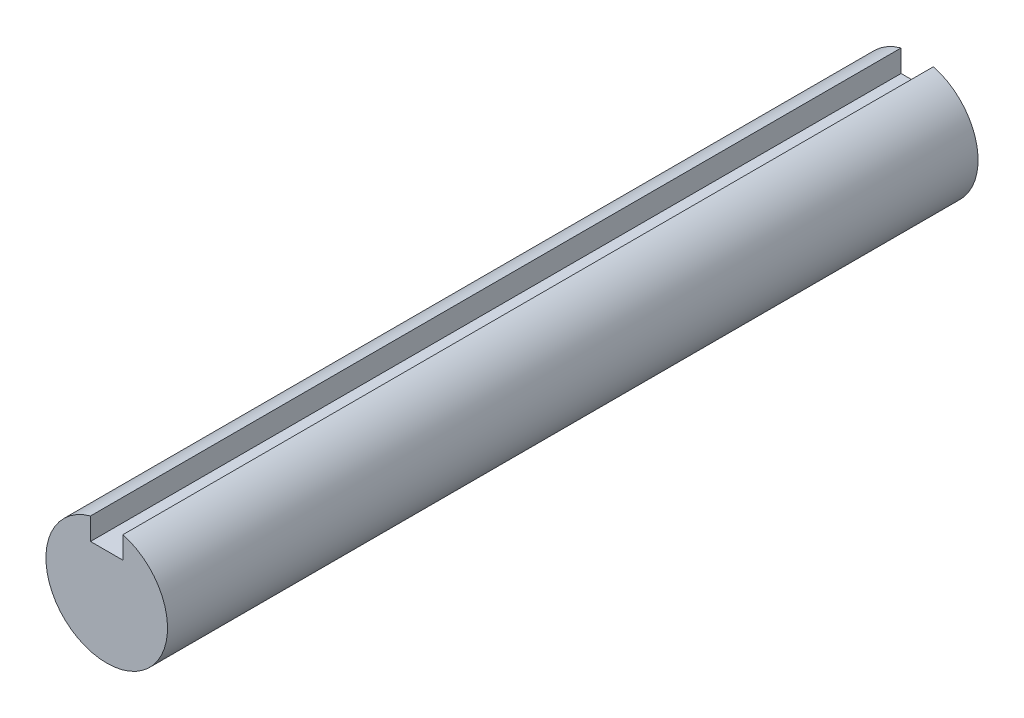
ISO-10303-21;
HEADER;
FILE_DESCRIPTION(('STEP AP214'),'2;1');
FILE_NAME('part.step','',(''),(''),'','','');
FILE_SCHEMA(('AUTOMOTIVE_DESIGN { 1 0 10303 214 1 1 1 1 }'));
ENDSEC;
DATA;
#1=APPLICATION_CONTEXT('core data for automotive mechanical design processes');
#2=APPLICATION_PROTOCOL_DEFINITION('international standard','automotive_design',2000,#1);
#3=PRODUCT_CONTEXT('',#1,'mechanical');
#4=PRODUCT('Part','Part','',(#3));
#5=PRODUCT_RELATED_PRODUCT_CATEGORY('part','',(#4));
#6=PRODUCT_DEFINITION_FORMATION('','',#4);
#7=PRODUCT_DEFINITION_CONTEXT('part definition',#1,'design');
#8=PRODUCT_DEFINITION('design','',#6,#7);
#9=PRODUCT_DEFINITION_SHAPE('','',#8);
#10=(LENGTH_UNIT() NAMED_UNIT(*) SI_UNIT(.MILLI.,.METRE.));
#11=(NAMED_UNIT(*) PLANE_ANGLE_UNIT() SI_UNIT($,.RADIAN.));
#12=(NAMED_UNIT(*) SI_UNIT($,.STERADIAN.) SOLID_ANGLE_UNIT());
#13=UNCERTAINTY_MEASURE_WITH_UNIT(LENGTH_MEASURE(1.E-05),#10,'distance_accuracy_value','');
#14=(GEOMETRIC_REPRESENTATION_CONTEXT(3) GLOBAL_UNCERTAINTY_ASSIGNED_CONTEXT((#13)) GLOBAL_UNIT_ASSIGNED_CONTEXT((#10,
#11,#12)) REPRESENTATION_CONTEXT('',''));
#15=CARTESIAN_POINT('',(0.,0.,0.));
#16=DIRECTION('',(0.,0.,1.));
#17=DIRECTION('',(1.,0.,0.));
#18=AXIS2_PLACEMENT_3D('',#15,#16,#17);
#19=CARTESIAN_POINT('',(0.,0.,10.));
#20=DIRECTION('',(0.,0.,-1.));
#21=DIRECTION('',(-1.,0.,0.));
#22=AXIS2_PLACEMENT_3D('',#19,#20,#21);
#23=CYLINDRICAL_SURFACE('',#22,0.75);
#24=DIRECTION('',(0.,0.,-1.));
#25=VECTOR('',#24,1.);
#26=CARTESIAN_POINT('',(-0.2,0.722841614740048,10.));
#27=LINE('',#26,#25);
#28=CARTESIAN_POINT('',(-0.2,0.722841614740048,0.));
#29=VERTEX_POINT('',#28);
#30=CARTESIAN_POINT('',(-0.2,0.722841614740048,10.));
#31=VERTEX_POINT('',#30);
#32=EDGE_CURVE('E98',#29,#31,#27,.F.);
#33=ORIENTED_EDGE('',*,*,#32,.F.);
#34=CARTESIAN_POINT('',(0.,0.,0.));
#35=DIRECTION('',(0.,0.,1.));
#36=DIRECTION('',(1.,0.,0.));
#37=AXIS2_PLACEMENT_3D('',#34,#35,#36);
#38=CIRCLE('',#37,0.75);
#39=CARTESIAN_POINT('',(0.2,0.722841614740048,0.));
#40=VERTEX_POINT('',#39);
#41=EDGE_CURVE('E45',#29,#40,#38,.T.);
#42=ORIENTED_EDGE('',*,*,#41,.T.);
#43=DIRECTION('',(0.,0.,-1.));
#44=VECTOR('',#43,1.);
#45=CARTESIAN_POINT('',(0.2,0.722841614740048,10.));
#46=LINE('',#45,#44);
#47=CARTESIAN_POINT('',(0.2,0.722841614740048,10.));
#48=VERTEX_POINT('',#47);
#49=EDGE_CURVE('E111',#40,#48,#46,.F.);
#50=ORIENTED_EDGE('',*,*,#49,.T.);
#51=CARTESIAN_POINT('',(0.,0.,10.));
#52=DIRECTION('',(0.,0.,1.));
#53=DIRECTION('',(1.,0.,0.));
#54=AXIS2_PLACEMENT_3D('',#51,#52,#53);
#55=CIRCLE('',#54,0.75);
#56=EDGE_CURVE('E11',#31,#48,#55,.T.);
#57=ORIENTED_EDGE('',*,*,#56,.F.);
#58=EDGE_LOOP('',(#33,#42,#50,#57));
#59=FACE_BOUND('',#58,.T.);
#60=ADVANCED_FACE('F42',(#59),#23,.T.);
#61=CARTESIAN_POINT('',(0.,0.,10.));
#62=DIRECTION('',(0.,0.,1.));
#63=DIRECTION('',(1.,0.,0.));
#64=AXIS2_PLACEMENT_3D('',#61,#62,#63);
#65=PLANE('',#64);
#66=DIRECTION('',(1.,0.,0.));
#67=VECTOR('',#66,1.);
#68=CARTESIAN_POINT('',(0.,0.45,10.));
#69=LINE('',#68,#67);
#70=CARTESIAN_POINT('',(-0.2,0.45,10.));
#71=VERTEX_POINT('',#70);
#72=CARTESIAN_POINT('',(0.2,0.45,10.));
#73=VERTEX_POINT('',#72);
#74=EDGE_CURVE('E104',#71,#73,#69,.T.);
#75=ORIENTED_EDGE('',*,*,#74,.F.);
#76=DIRECTION('',(0.,1.,0.));
#77=VECTOR('',#76,1.);
#78=CARTESIAN_POINT('',(-0.2,0.45,10.));
#79=LINE('',#78,#77);
#80=EDGE_CURVE('E97',#71,#31,#79,.T.);
#81=ORIENTED_EDGE('',*,*,#80,.T.);
#82=ORIENTED_EDGE('',*,*,#56,.T.);
#83=DIRECTION('',(0.,1.,0.));
#84=VECTOR('',#83,1.);
#85=CARTESIAN_POINT('',(0.2,0.45,10.));
#86=LINE('',#85,#84);
#87=EDGE_CURVE('E91',#73,#48,#86,.T.);
#88=ORIENTED_EDGE('',*,*,#87,.F.);
#89=EDGE_LOOP('',(#75,#81,#82,#88));
#90=FACE_BOUND('',#89,.T.);
#91=ADVANCED_FACE('F116',(#90),#65,.T.);
#92=CARTESIAN_POINT('',(0.,0.,0.));
#93=DIRECTION('',(0.,0.,1.));
#94=DIRECTION('',(1.,0.,0.));
#95=AXIS2_PLACEMENT_3D('',#92,#93,#94);
#96=PLANE('',#95);
#97=DIRECTION('',(0.,1.,0.));
#98=VECTOR('',#97,1.);
#99=CARTESIAN_POINT('',(-0.2,0.45,0.));
#100=LINE('',#99,#98);
#101=CARTESIAN_POINT('',(-0.2,0.45,0.));
#102=VERTEX_POINT('',#101);
#103=EDGE_CURVE('E95',#102,#29,#100,.T.);
#104=ORIENTED_EDGE('',*,*,#103,.F.);
#105=DIRECTION('',(1.,0.,0.));
#106=VECTOR('',#105,1.);
#107=CARTESIAN_POINT('',(0.,0.45,0.));
#108=LINE('',#107,#106);
#109=CARTESIAN_POINT('',(0.2,0.45,0.));
#110=VERTEX_POINT('',#109);
#111=EDGE_CURVE('E82',#102,#110,#108,.T.);
#112=ORIENTED_EDGE('',*,*,#111,.T.);
#113=DIRECTION('',(0.,1.,0.));
#114=VECTOR('',#113,1.);
#115=CARTESIAN_POINT('',(0.2,0.45,0.));
#116=LINE('',#115,#114);
#117=EDGE_CURVE('E56',#110,#40,#116,.T.);
#118=ORIENTED_EDGE('',*,*,#117,.T.);
#119=ORIENTED_EDGE('',*,*,#41,.F.);
#120=EDGE_LOOP('',(#104,#112,#118,#119));
#121=FACE_BOUND('',#120,.T.);
#122=ADVANCED_FACE('F100',(#121),#96,.F.);
#123=CARTESIAN_POINT('',(0.2,0.45,0.));
#124=DIRECTION('',(1.,0.,0.));
#125=DIRECTION('',(0.,0.,-1.));
#126=AXIS2_PLACEMENT_3D('',#123,#124,#125);
#127=PLANE('',#126);
#128=ORIENTED_EDGE('',*,*,#117,.F.);
#129=DIRECTION('',(0.,0.,1.));
#130=VECTOR('',#129,1.);
#131=CARTESIAN_POINT('',(0.2,0.45,0.));
#132=LINE('',#131,#130);
#133=EDGE_CURVE('E88',#110,#73,#132,.T.);
#134=ORIENTED_EDGE('',*,*,#133,.T.);
#135=ORIENTED_EDGE('',*,*,#87,.T.);
#136=ORIENTED_EDGE('',*,*,#49,.F.);
#137=EDGE_LOOP('',(#128,#134,#135,#136));
#138=FACE_BOUND('',#137,.T.);
#139=ADVANCED_FACE('F113',(#138),#127,.F.);
#140=CARTESIAN_POINT('',(0.,0.45,0.));
#141=DIRECTION('',(0.,-1.,0.));
#142=DIRECTION('',(0.,0.,-1.));
#143=AXIS2_PLACEMENT_3D('',#140,#141,#142);
#144=PLANE('',#143);
#145=ORIENTED_EDGE('',*,*,#74,.T.);
#146=ORIENTED_EDGE('',*,*,#133,.F.);
#147=ORIENTED_EDGE('',*,*,#111,.F.);
#148=DIRECTION('',(0.,0.,1.));
#149=VECTOR('',#148,1.);
#150=CARTESIAN_POINT('',(-0.2,0.45,0.));
#151=LINE('',#150,#149);
#152=EDGE_CURVE('E86',#102,#71,#151,.T.);
#153=ORIENTED_EDGE('',*,*,#152,.T.);
#154=EDGE_LOOP('',(#145,#146,#147,#153));
#155=FACE_BOUND('',#154,.T.);
#156=ADVANCED_FACE('F85',(#155),#144,.F.);
#157=CARTESIAN_POINT('',(-0.2,0.45,0.));
#158=DIRECTION('',(1.,0.,0.));
#159=DIRECTION('',(0.,0.,-1.));
#160=AXIS2_PLACEMENT_3D('',#157,#158,#159);
#161=PLANE('',#160);
#162=ORIENTED_EDGE('',*,*,#32,.T.);
#163=ORIENTED_EDGE('',*,*,#80,.F.);
#164=ORIENTED_EDGE('',*,*,#152,.F.);
#165=ORIENTED_EDGE('',*,*,#103,.T.);
#166=EDGE_LOOP('',(#162,#163,#164,#165));
#167=FACE_BOUND('',#166,.T.);
#168=ADVANCED_FACE('F94',(#167),#161,.T.);
#169=CLOSED_SHELL('',(#60,#91,#122,#139,#156,#168));
#170=MANIFOLD_SOLID_BREP('B2',#169);
#171=ADVANCED_BREP_SHAPE_REPRESENTATION('',(#18,#170),#14);
#172=SHAPE_DEFINITION_REPRESENTATION(#9,#171);
ENDSEC;
END-ISO-10303-21;
